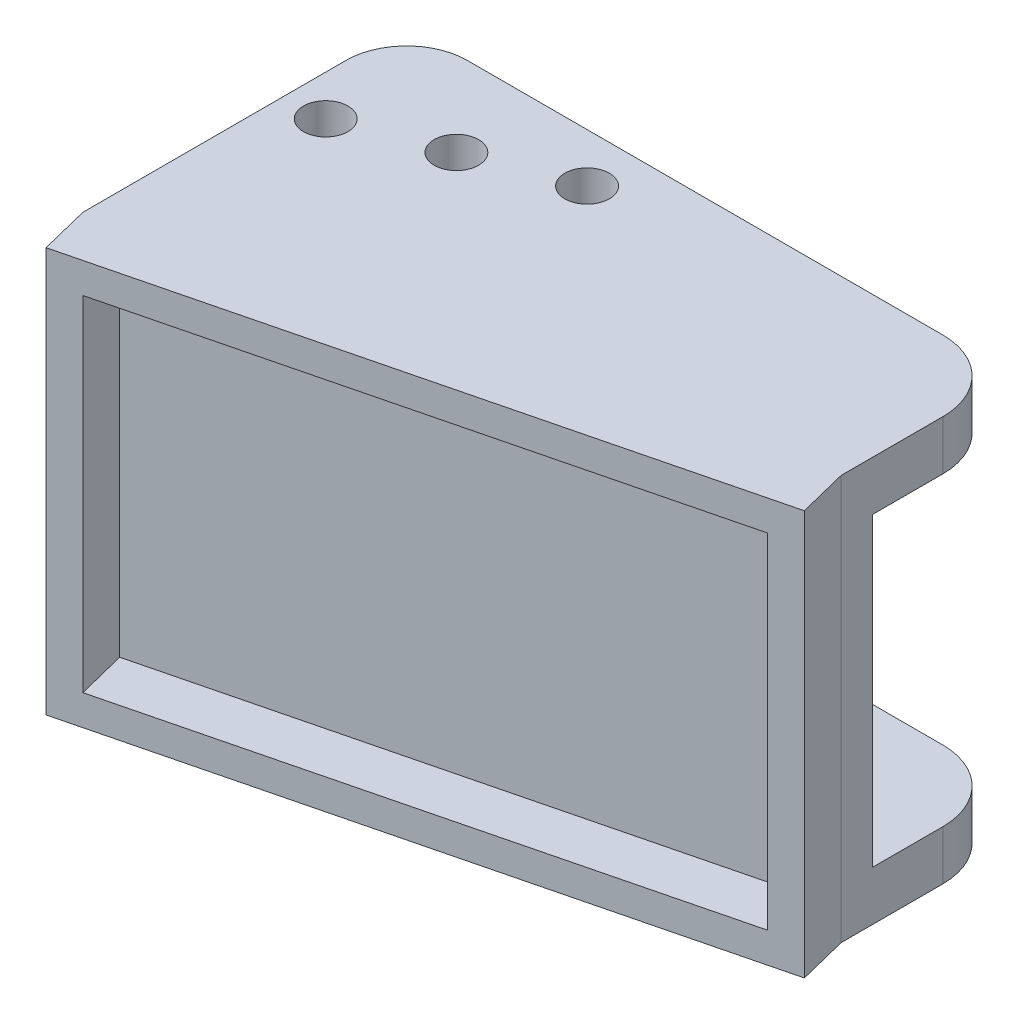
ISO-10303-21;
HEADER;
FILE_DESCRIPTION(('STEP AP214'),'2;1');
FILE_NAME('part.step','',(''),(''),'','','');
FILE_SCHEMA(('AUTOMOTIVE_DESIGN { 1 0 10303 214 1 1 1 1 }'));
ENDSEC;
DATA;
#1=APPLICATION_CONTEXT('core data for automotive mechanical design processes');
#2=APPLICATION_PROTOCOL_DEFINITION('international standard','automotive_design',2000,#1);
#3=PRODUCT_CONTEXT('',#1,'mechanical');
#4=PRODUCT('Part','Part','',(#3));
#5=PRODUCT_RELATED_PRODUCT_CATEGORY('part','',(#4));
#6=PRODUCT_DEFINITION_FORMATION('','',#4);
#7=PRODUCT_DEFINITION_CONTEXT('part definition',#1,'design');
#8=PRODUCT_DEFINITION('design','',#6,#7);
#9=PRODUCT_DEFINITION_SHAPE('','',#8);
#10=(LENGTH_UNIT() NAMED_UNIT(*) SI_UNIT(.MILLI.,.METRE.));
#11=(NAMED_UNIT(*) PLANE_ANGLE_UNIT() SI_UNIT($,.RADIAN.));
#12=(NAMED_UNIT(*) SI_UNIT($,.STERADIAN.) SOLID_ANGLE_UNIT());
#13=UNCERTAINTY_MEASURE_WITH_UNIT(LENGTH_MEASURE(1.E-05),#10,'distance_accuracy_value','');
#14=(GEOMETRIC_REPRESENTATION_CONTEXT(3) GLOBAL_UNCERTAINTY_ASSIGNED_CONTEXT((#13)) GLOBAL_UNIT_ASSIGNED_CONTEXT((#10,
#11,#12)) REPRESENTATION_CONTEXT('',''));
#15=CARTESIAN_POINT('',(0.,0.,0.));
#16=DIRECTION('',(0.,0.,1.));
#17=DIRECTION('',(1.,0.,0.));
#18=AXIS2_PLACEMENT_3D('',#15,#16,#17);
#19=CARTESIAN_POINT('',(-15.,20.,-8.));
#20=DIRECTION('',(0.,0.,1.));
#21=DIRECTION('',(1.,0.,0.));
#22=AXIS2_PLACEMENT_3D('',#19,#20,#21);
#23=PLANE('',#22);
#24=DIRECTION('',(-1.,0.,0.));
#25=VECTOR('',#24,1.);
#26=CARTESIAN_POINT('',(15.,2.45,-8.));
#27=LINE('',#26,#25);
#28=CARTESIAN_POINT('',(11.5,2.45,-8.));
#29=VERTEX_POINT('',#28);
#30=CARTESIAN_POINT('',(-12.,2.45,-8.));
#31=VERTEX_POINT('',#30);
#32=EDGE_CURVE('E228',#29,#31,#27,.T.);
#33=ORIENTED_EDGE('',*,*,#32,.F.);
#34=DIRECTION('',(0.,-1.,0.));
#35=VECTOR('',#34,1.);
#36=CARTESIAN_POINT('',(11.5,20.,-8.));
#37=LINE('',#36,#35);
#38=CARTESIAN_POINT('',(11.5,0.,-8.));
#39=VERTEX_POINT('',#38);
#40=EDGE_CURVE('E333',#29,#39,#37,.T.);
#41=ORIENTED_EDGE('',*,*,#40,.T.);
#42=DIRECTION('',(-1.,0.,0.));
#43=VECTOR('',#42,1.);
#44=CARTESIAN_POINT('',(-15.,0.,-8.));
#45=LINE('',#44,#43);
#46=CARTESIAN_POINT('',(-12.,0.,-8.));
#47=VERTEX_POINT('',#46);
#48=EDGE_CURVE('E293',#39,#47,#45,.T.);
#49=ORIENTED_EDGE('',*,*,#48,.T.);
#50=DIRECTION('',(0.,-1.,0.));
#51=VECTOR('',#50,1.);
#52=CARTESIAN_POINT('',(-12.,20.,-8.));
#53=LINE('',#52,#51);
#54=EDGE_CURVE('E321',#47,#31,#53,.F.);
#55=ORIENTED_EDGE('',*,*,#54,.T.);
#56=EDGE_LOOP('',(#33,#41,#49,#55));
#57=FACE_BOUND('',#56,.T.);
#58=ADVANCED_FACE('F41',(#57),#23,.F.);
#59=CARTESIAN_POINT('',(-3.66419573502799,0.,-5.58367949545302));
#60=DIRECTION('',(0.,1.,0.));
#61=DIRECTION('',(0.,0.,1.));
#62=AXIS2_PLACEMENT_3D('',#59,#60,#61);
#63=CYLINDRICAL_SURFACE('',#62,1.1);
#64=CARTESIAN_POINT('',(-3.66419573502799,2.45,-5.58367949545302));
#65=DIRECTION('',(0.,-1.,0.));
#66=DIRECTION('',(0.,0.,-1.));
#67=AXIS2_PLACEMENT_3D('',#64,#65,#66);
#68=CIRCLE('',#67,1.1);
#69=CARTESIAN_POINT('',(-3.66419573502799,2.45,-6.68367949545302));
#70=VERTEX_POINT('',#69);
#71=EDGE_CURVE('E268',#70,#70,#68,.F.);
#72=ORIENTED_EDGE('',*,*,#71,.T.);
#73=EDGE_LOOP('',(#72));
#74=FACE_BOUND('',#73,.T.);
#75=CARTESIAN_POINT('',(-3.66419573502799,0.,-5.58367949545302));
#76=DIRECTION('',(0.,1.,0.));
#77=DIRECTION('',(0.,0.,1.));
#78=AXIS2_PLACEMENT_3D('',#75,#76,#77);
#79=CIRCLE('',#78,1.1);
#80=CARTESIAN_POINT('',(-3.66419573502799,0.,-4.48367949545302));
#81=VERTEX_POINT('',#80);
#82=EDGE_CURVE('E271',#81,#81,#79,.T.);
#83=ORIENTED_EDGE('',*,*,#82,.F.);
#84=EDGE_LOOP('',(#83));
#85=FACE_BOUND('',#84,.T.);
#86=ADVANCED_FACE('F402',(#74,#85),#63,.F.);
#87=CARTESIAN_POINT('',(-8.33209786751399,0.,-3.79183974772651));
#88=DIRECTION('',(0.,1.,0.));
#89=DIRECTION('',(0.,0.,1.));
#90=AXIS2_PLACEMENT_3D('',#87,#88,#89);
#91=CYLINDRICAL_SURFACE('',#90,1.1);
#92=CARTESIAN_POINT('',(-8.33209786751399,2.45,-3.79183974772651));
#93=DIRECTION('',(0.,-1.,0.));
#94=DIRECTION('',(0.,0.,-1.));
#95=AXIS2_PLACEMENT_3D('',#92,#93,#94);
#96=CIRCLE('',#95,1.1);
#97=CARTESIAN_POINT('',(-8.33209786751399,2.45,-4.89183974772651));
#98=VERTEX_POINT('',#97);
#99=EDGE_CURVE('E265',#98,#98,#96,.F.);
#100=ORIENTED_EDGE('',*,*,#99,.T.);
#101=EDGE_LOOP('',(#100));
#102=FACE_BOUND('',#101,.T.);
#103=CARTESIAN_POINT('',(-8.33209786751399,0.,-3.79183974772651));
#104=DIRECTION('',(0.,1.,0.));
#105=DIRECTION('',(0.,0.,1.));
#106=AXIS2_PLACEMENT_3D('',#103,#104,#105);
#107=CIRCLE('',#106,1.1);
#108=CARTESIAN_POINT('',(-8.33209786751399,0.,-2.69183974772651));
#109=VERTEX_POINT('',#108);
#110=EDGE_CURVE('E282',#109,#109,#107,.T.);
#111=ORIENTED_EDGE('',*,*,#110,.F.);
#112=EDGE_LOOP('',(#111));
#113=FACE_BOUND('',#112,.T.);
#114=ADVANCED_FACE('F409',(#102,#113),#91,.F.);
#115=CARTESIAN_POINT('',(-13.,0.,-2.));
#116=DIRECTION('',(0.,1.,0.));
#117=DIRECTION('',(0.,0.,1.));
#118=AXIS2_PLACEMENT_3D('',#115,#116,#117);
#119=CYLINDRICAL_SURFACE('',#118,1.1);
#120=CARTESIAN_POINT('',(-13.,2.45,-2.));
#121=DIRECTION('',(0.,-1.,0.));
#122=DIRECTION('',(0.,0.,-1.));
#123=AXIS2_PLACEMENT_3D('',#120,#121,#122);
#124=CIRCLE('',#123,1.1);
#125=CARTESIAN_POINT('',(-13.,2.45,-3.1));
#126=VERTEX_POINT('',#125);
#127=EDGE_CURVE('E264',#126,#126,#124,.F.);
#128=ORIENTED_EDGE('',*,*,#127,.T.);
#129=EDGE_LOOP('',(#128));
#130=FACE_BOUND('',#129,.T.);
#131=CARTESIAN_POINT('',(-13.,0.,-2.));
#132=DIRECTION('',(0.,1.,0.));
#133=DIRECTION('',(0.,0.,1.));
#134=AXIS2_PLACEMENT_3D('',#131,#132,#133);
#135=CIRCLE('',#134,1.1);
#136=CARTESIAN_POINT('',(-13.,0.,-0.9));
#137=VERTEX_POINT('',#136);
#138=EDGE_CURVE('E272',#137,#137,#135,.T.);
#139=ORIENTED_EDGE('',*,*,#138,.F.);
#140=EDGE_LOOP('',(#139));
#141=FACE_BOUND('',#140,.T.);
#142=ADVANCED_FACE('F424',(#130,#141),#119,.F.);
#143=CARTESIAN_POINT('',(-15.,20.,-8.));
#144=DIRECTION('',(1.,0.,0.));
#145=DIRECTION('',(0.,0.,-1.));
#146=AXIS2_PLACEMENT_3D('',#143,#144,#145);
#147=PLANE('',#146);
#148=DIRECTION('',(0.,0.,-1.));
#149=VECTOR('',#148,1.);
#150=CARTESIAN_POINT('',(-15.,2.45,36.8141121698799));
#151=LINE('',#150,#149);
#152=CARTESIAN_POINT('',(-15.,2.45,6.45407955597516));
#153=VERTEX_POINT('',#152);
#154=CARTESIAN_POINT('',(-15.,2.45,-5.));
#155=VERTEX_POINT('',#154);
#156=EDGE_CURVE('E236',#153,#155,#151,.T.);
#157=ORIENTED_EDGE('',*,*,#156,.T.);
#158=DIRECTION('',(0.,-1.,0.));
#159=VECTOR('',#158,1.);
#160=CARTESIAN_POINT('',(-15.,20.,-5.));
#161=LINE('',#160,#159);
#162=CARTESIAN_POINT('',(-15.,0.,-5.));
#163=VERTEX_POINT('',#162);
#164=EDGE_CURVE('E315',#155,#163,#161,.T.);
#165=ORIENTED_EDGE('',*,*,#164,.T.);
#166=DIRECTION('',(0.,0.,1.));
#167=VECTOR('',#166,1.);
#168=CARTESIAN_POINT('',(-15.,0.,-8.));
#169=LINE('',#168,#167);
#170=CARTESIAN_POINT('',(-15.,0.,8.));
#171=VERTEX_POINT('',#170);
#172=EDGE_CURVE('E275',#163,#171,#169,.T.);
#173=ORIENTED_EDGE('',*,*,#172,.T.);
#174=DIRECTION('',(0.,-1.,0.));
#175=VECTOR('',#174,1.);
#176=CARTESIAN_POINT('',(-15.,20.,8.));
#177=LINE('',#176,#175);
#178=CARTESIAN_POINT('',(-15.,20.,8.));
#179=VERTEX_POINT('',#178);
#180=EDGE_CURVE('E305',#179,#171,#177,.T.);
#181=ORIENTED_EDGE('',*,*,#180,.F.);
#182=DIRECTION('',(0.,0.,1.));
#183=VECTOR('',#182,1.);
#184=CARTESIAN_POINT('',(-15.,20.,-8.));
#185=LINE('',#184,#183);
#186=CARTESIAN_POINT('',(-15.,20.,-5.));
#187=VERTEX_POINT('',#186);
#188=EDGE_CURVE('E290',#187,#179,#185,.T.);
#189=ORIENTED_EDGE('',*,*,#188,.F.);
#190=DIRECTION('',(0.,-1.,0.));
#191=VECTOR('',#190,1.);
#192=CARTESIAN_POINT('',(-15.,20.,-5.));
#193=LINE('',#192,#191);
#194=CARTESIAN_POINT('',(-15.,17.55,-5.));
#195=VERTEX_POINT('',#194);
#196=EDGE_CURVE('E308',#187,#195,#193,.T.);
#197=ORIENTED_EDGE('',*,*,#196,.T.);
#198=DIRECTION('',(0.,0.,-1.));
#199=VECTOR('',#198,1.);
#200=CARTESIAN_POINT('',(-15.,17.55,36.8141121698799));
#201=LINE('',#200,#199);
#202=CARTESIAN_POINT('',(-15.,17.55,6.45407955597516));
#203=VERTEX_POINT('',#202);
#204=EDGE_CURVE('E245',#203,#195,#201,.T.);
#205=ORIENTED_EDGE('',*,*,#204,.F.);
#206=DIRECTION('',(0.,1.,0.));
#207=VECTOR('',#206,1.);
#208=CARTESIAN_POINT('',(-15.,17.55,6.45407955597516));
#209=LINE('',#208,#207);
#210=EDGE_CURVE('E246',#153,#203,#209,.T.);
#211=ORIENTED_EDGE('',*,*,#210,.F.);
#212=EDGE_LOOP('',(#157,#165,#173,#181,#189,#197,#205,#211));
#213=FACE_BOUND('',#212,.T.);
#214=ADVANCED_FACE('F364',(#213),#147,.F.);
#215=CARTESIAN_POINT('',(15.,20.,-8.));
#216=DIRECTION('',(-1.,0.,0.));
#217=DIRECTION('',(0.,0.,1.));
#218=AXIS2_PLACEMENT_3D('',#215,#216,#217);
#219=PLANE('',#218);
#220=DIRECTION('',(0.,0.,-1.));
#221=VECTOR('',#220,1.);
#222=CARTESIAN_POINT('',(15.,0.,-8.));
#223=LINE('',#222,#221);
#224=CARTESIAN_POINT('',(15.,0.,0.520159914704548));
#225=VERTEX_POINT('',#224);
#226=CARTESIAN_POINT('',(15.,0.,-4.5));
#227=VERTEX_POINT('',#226);
#228=EDGE_CURVE('E299',#225,#227,#223,.T.);
#229=ORIENTED_EDGE('',*,*,#228,.T.);
#230=DIRECTION('',(0.,-1.,0.));
#231=VECTOR('',#230,1.);
#232=CARTESIAN_POINT('',(15.,20.,-4.5));
#233=LINE('',#232,#231);
#234=CARTESIAN_POINT('',(15.,2.45,-4.5));
#235=VERTEX_POINT('',#234);
#236=EDGE_CURVE('E340',#227,#235,#233,.F.);
#237=ORIENTED_EDGE('',*,*,#236,.T.);
#238=DIRECTION('',(0.,0.,-1.));
#239=VECTOR('',#238,1.);
#240=CARTESIAN_POINT('',(15.,2.45,36.8141121698799));
#241=LINE('',#240,#239);
#242=CARTESIAN_POINT('',(15.,2.45,-1.0257605293203));
#243=VERTEX_POINT('',#242);
#244=EDGE_CURVE('E240',#243,#235,#241,.T.);
#245=ORIENTED_EDGE('',*,*,#244,.F.);
#246=DIRECTION('',(0.,-1.,0.));
#247=VECTOR('',#246,1.);
#248=CARTESIAN_POINT('',(15.,17.55,-1.0257605293203));
#249=LINE('',#248,#247);
#250=CARTESIAN_POINT('',(15.,17.55,-1.0257605293203));
#251=VERTEX_POINT('',#250);
#252=EDGE_CURVE('E237',#251,#243,#249,.T.);
#253=ORIENTED_EDGE('',*,*,#252,.F.);
#254=DIRECTION('',(0.,0.,-1.));
#255=VECTOR('',#254,1.);
#256=CARTESIAN_POINT('',(15.,17.55,36.8141121698799));
#257=LINE('',#256,#255);
#258=CARTESIAN_POINT('',(15.,17.55,-4.5));
#259=VERTEX_POINT('',#258);
#260=EDGE_CURVE('E241',#251,#259,#257,.T.);
#261=ORIENTED_EDGE('',*,*,#260,.T.);
#262=DIRECTION('',(0.,-1.,0.));
#263=VECTOR('',#262,1.);
#264=CARTESIAN_POINT('',(15.,20.,-4.5));
#265=LINE('',#264,#263);
#266=CARTESIAN_POINT('',(15.,20.,-4.5));
#267=VERTEX_POINT('',#266);
#268=EDGE_CURVE('E338',#259,#267,#265,.F.);
#269=ORIENTED_EDGE('',*,*,#268,.T.);
#270=DIRECTION('',(0.,0.,-1.));
#271=VECTOR('',#270,1.);
#272=CARTESIAN_POINT('',(15.,20.,-8.));
#273=LINE('',#272,#271);
#274=CARTESIAN_POINT('',(15.,20.,0.520159914704548));
#275=VERTEX_POINT('',#274);
#276=EDGE_CURVE('E292',#275,#267,#273,.T.);
#277=ORIENTED_EDGE('',*,*,#276,.F.);
#278=DIRECTION('',(0.,-1.,0.));
#279=VECTOR('',#278,1.);
#280=CARTESIAN_POINT('',(15.,20.,0.520159914704548));
#281=LINE('',#280,#279);
#282=EDGE_CURVE('E297',#275,#225,#281,.T.);
#283=ORIENTED_EDGE('',*,*,#282,.T.);
#284=EDGE_LOOP('',(#229,#237,#245,#253,#261,#269,#277,#283));
#285=FACE_BOUND('',#284,.T.);
#286=ADVANCED_FACE('F351',(#285),#219,.F.);
#287=DIRECTION('',(-1.,0.,0.));
#288=VECTOR('',#287,1.);
#289=CARTESIAN_POINT('',(-15.,20.,-8.));
#290=LINE('',#289,#288);
#291=CARTESIAN_POINT('',(11.5,20.,-8.));
#292=VERTEX_POINT('',#291);
#293=CARTESIAN_POINT('',(-12.,20.,-8.));
#294=VERTEX_POINT('',#293);
#295=EDGE_CURVE('E295',#292,#294,#290,.T.);
#296=ORIENTED_EDGE('',*,*,#295,.F.);
#297=DIRECTION('',(0.,-1.,0.));
#298=VECTOR('',#297,1.);
#299=CARTESIAN_POINT('',(11.5,20.,-8.));
#300=LINE('',#299,#298);
#301=CARTESIAN_POINT('',(11.5,17.55,-8.));
#302=VERTEX_POINT('',#301);
#303=EDGE_CURVE('E344',#292,#302,#300,.T.);
#304=ORIENTED_EDGE('',*,*,#303,.T.);
#305=DIRECTION('',(1.,0.,0.));
#306=VECTOR('',#305,1.);
#307=CARTESIAN_POINT('',(15.,17.55,-8.));
#308=LINE('',#307,#306);
#309=CARTESIAN_POINT('',(-12.,17.55,-8.));
#310=VERTEX_POINT('',#309);
#311=EDGE_CURVE('E229',#310,#302,#308,.T.);
#312=ORIENTED_EDGE('',*,*,#311,.F.);
#313=DIRECTION('',(0.,-1.,0.));
#314=VECTOR('',#313,1.);
#315=CARTESIAN_POINT('',(-12.,20.,-8.));
#316=LINE('',#315,#314);
#317=EDGE_CURVE('E328',#310,#294,#316,.F.);
#318=ORIENTED_EDGE('',*,*,#317,.T.);
#319=EDGE_LOOP('',(#296,#304,#312,#318));
#320=FACE_BOUND('',#319,.T.);
#321=ADVANCED_FACE('F354',(#320),#23,.F.);
#322=CARTESIAN_POINT('',(0.,20.,0.));
#323=DIRECTION('',(0.,1.,0.));
#324=DIRECTION('',(0.,0.,1.));
#325=AXIS2_PLACEMENT_3D('',#322,#323,#324);
#326=PLANE('',#325);
#327=CARTESIAN_POINT('',(-13.,20.,-2.));
#328=DIRECTION('',(0.,1.,0.));
#329=DIRECTION('',(0.,0.,1.));
#330=AXIS2_PLACEMENT_3D('',#327,#328,#329);
#331=CIRCLE('',#330,1.1);
#332=CARTESIAN_POINT('',(-13.,20.,-0.9));
#333=VERTEX_POINT('',#332);
#334=EDGE_CURVE('E276',#333,#333,#331,.T.);
#335=ORIENTED_EDGE('',*,*,#334,.F.);
#336=EDGE_LOOP('',(#335));
#337=FACE_BOUND('',#336,.T.);
#338=CARTESIAN_POINT('',(-8.33209786751399,20.,-3.79183974772651));
#339=DIRECTION('',(0.,1.,0.));
#340=DIRECTION('',(0.,0.,1.));
#341=AXIS2_PLACEMENT_3D('',#338,#339,#340);
#342=CIRCLE('',#341,1.1);
#343=CARTESIAN_POINT('',(-8.33209786751399,20.,-2.69183974772651));
#344=VERTEX_POINT('',#343);
#345=EDGE_CURVE('E279',#344,#344,#342,.T.);
#346=ORIENTED_EDGE('',*,*,#345,.F.);
#347=EDGE_LOOP('',(#346));
#348=FACE_BOUND('',#347,.T.);
#349=CARTESIAN_POINT('',(-3.66419573502799,20.,-5.58367949545302));
#350=DIRECTION('',(0.,1.,0.));
#351=DIRECTION('',(0.,0.,1.));
#352=AXIS2_PLACEMENT_3D('',#349,#350,#351);
#353=CIRCLE('',#352,1.1);
#354=CARTESIAN_POINT('',(-3.66419573502799,20.,-4.48367949545302));
#355=VERTEX_POINT('',#354);
#356=EDGE_CURVE('E285',#355,#355,#353,.T.);
#357=ORIENTED_EDGE('',*,*,#356,.F.);
#358=EDGE_LOOP('',(#357));
#359=FACE_BOUND('',#358,.T.);
#360=ORIENTED_EDGE('',*,*,#276,.T.);
#361=CARTESIAN_POINT('',(11.5,20.,-4.5));
#362=DIRECTION('',(0.,1.,0.));
#363=DIRECTION('',(0.,0.,1.));
#364=AXIS2_PLACEMENT_3D('',#361,#362,#363);
#365=CIRCLE('',#364,3.5);
#366=EDGE_CURVE('E11',#267,#292,#365,.T.);
#367=ORIENTED_EDGE('',*,*,#366,.T.);
#368=ORIENTED_EDGE('',*,*,#295,.T.);
#369=CARTESIAN_POINT('',(-12.,20.,-5.));
#370=DIRECTION('',(0.,1.,0.));
#371=DIRECTION('',(0.,0.,1.));
#372=AXIS2_PLACEMENT_3D('',#369,#370,#371);
#373=CIRCLE('',#372,3.);
#374=EDGE_CURVE('E331',#294,#187,#373,.T.);
#375=ORIENTED_EDGE('',*,*,#374,.T.);
#376=ORIENTED_EDGE('',*,*,#188,.T.);
#377=DIRECTION('',(-0.241921895599669,0.,-0.970295726275996));
#378=VECTOR('',#377,1.);
#379=CARTESIAN_POINT('',(-14.3951952610008,20.,10.42573931569));
#380=LINE('',#379,#378);
#381=CARTESIAN_POINT('',(-14.3951952610008,20.,10.42573931569));
#382=VERTEX_POINT('',#381);
#383=EDGE_CURVE('E216',#382,#179,#380,.T.);
#384=ORIENTED_EDGE('',*,*,#383,.F.);
#385=DIRECTION('',(-0.970295726275996,0.,0.241921895599669));
#386=VECTOR('',#385,1.);
#387=CARTESIAN_POINT('',(-14.3951952610008,20.,10.42573931569));
#388=LINE('',#387,#386);
#389=CARTESIAN_POINT('',(15.6048047389992,20.,2.94589923039454));
#390=VERTEX_POINT('',#389);
#391=EDGE_CURVE('E214',#390,#382,#388,.T.);
#392=ORIENTED_EDGE('',*,*,#391,.F.);
#393=DIRECTION('',(-0.241921895599669,0.,-0.970295726275996));
#394=VECTOR('',#393,1.);
#395=CARTESIAN_POINT('',(15.6048047389992,20.,2.94589923039454));
#396=LINE('',#395,#394);
#397=EDGE_CURVE('E219',#390,#275,#396,.T.);
#398=ORIENTED_EDGE('',*,*,#397,.T.);
#399=EDGE_LOOP('',(#360,#367,#368,#375,#376,#384,#392,#398));
#400=FACE_BOUND('',#399,.T.);
#401=ADVANCED_FACE('F357',(#337,#348,#359,#400),#326,.T.);
#402=CARTESIAN_POINT('',(0.,0.,0.));
#403=DIRECTION('',(0.,1.,0.));
#404=DIRECTION('',(0.,0.,1.));
#405=AXIS2_PLACEMENT_3D('',#402,#403,#404);
#406=PLANE('',#405);
#407=ORIENTED_EDGE('',*,*,#138,.T.);
#408=EDGE_LOOP('',(#407));
#409=FACE_BOUND('',#408,.T.);
#410=ORIENTED_EDGE('',*,*,#110,.T.);
#411=EDGE_LOOP('',(#410));
#412=FACE_BOUND('',#411,.T.);
#413=ORIENTED_EDGE('',*,*,#82,.T.);
#414=EDGE_LOOP('',(#413));
#415=FACE_BOUND('',#414,.T.);
#416=ORIENTED_EDGE('',*,*,#48,.F.);
#417=CARTESIAN_POINT('',(11.5,0.,-4.5));
#418=DIRECTION('',(0.,1.,0.));
#419=DIRECTION('',(0.,0.,1.));
#420=AXIS2_PLACEMENT_3D('',#417,#418,#419);
#421=CIRCLE('',#420,3.5);
#422=EDGE_CURVE('E336',#39,#227,#421,.F.);
#423=ORIENTED_EDGE('',*,*,#422,.T.);
#424=ORIENTED_EDGE('',*,*,#228,.F.);
#425=DIRECTION('',(-0.241921895599669,0.,-0.970295726275996));
#426=VECTOR('',#425,1.);
#427=CARTESIAN_POINT('',(15.6048047389992,0.,2.94589923039454));
#428=LINE('',#427,#426);
#429=CARTESIAN_POINT('',(15.6048047389992,0.,2.94589923039454));
#430=VERTEX_POINT('',#429);
#431=EDGE_CURVE('E222',#430,#225,#428,.T.);
#432=ORIENTED_EDGE('',*,*,#431,.F.);
#433=DIRECTION('',(0.970295726275996,0.,-0.241921895599669));
#434=VECTOR('',#433,1.);
#435=CARTESIAN_POINT('',(-14.3951952610008,0.,10.42573931569));
#436=LINE('',#435,#434);
#437=CARTESIAN_POINT('',(-14.3951952610008,0.,10.42573931569));
#438=VERTEX_POINT('',#437);
#439=EDGE_CURVE('E210',#438,#430,#436,.T.);
#440=ORIENTED_EDGE('',*,*,#439,.F.);
#441=DIRECTION('',(-0.241921895599669,0.,-0.970295726275996));
#442=VECTOR('',#441,1.);
#443=CARTESIAN_POINT('',(-14.3951952610008,0.,10.42573931569));
#444=LINE('',#443,#442);
#445=EDGE_CURVE('E225',#438,#171,#444,.T.);
#446=ORIENTED_EDGE('',*,*,#445,.T.);
#447=ORIENTED_EDGE('',*,*,#172,.F.);
#448=CARTESIAN_POINT('',(-12.,0.,-5.));
#449=DIRECTION('',(0.,1.,0.));
#450=DIRECTION('',(0.,0.,1.));
#451=AXIS2_PLACEMENT_3D('',#448,#449,#450);
#452=CIRCLE('',#451,3.);
#453=EDGE_CURVE('E318',#163,#47,#452,.F.);
#454=ORIENTED_EDGE('',*,*,#453,.T.);
#455=EDGE_LOOP('',(#416,#423,#424,#432,#440,#446,#447,#454));
#456=FACE_BOUND('',#455,.T.);
#457=ADVANCED_FACE('F383',(#409,#412,#415,#456),#406,.F.);
#458=CARTESIAN_POINT('',(-3.66419573502799,17.55,-5.58367949545302));
#459=DIRECTION('',(0.,1.,0.));
#460=DIRECTION('',(0.,0.,1.));
#461=AXIS2_PLACEMENT_3D('',#458,#459,#460);
#462=CIRCLE('',#461,1.1);
#463=CARTESIAN_POINT('',(-3.66419573502799,17.55,-4.48367949545302));
#464=VERTEX_POINT('',#463);
#465=EDGE_CURVE('E261',#464,#464,#462,.F.);
#466=ORIENTED_EDGE('',*,*,#465,.T.);
#467=EDGE_LOOP('',(#466));
#468=FACE_BOUND('',#467,.T.);
#469=ORIENTED_EDGE('',*,*,#356,.T.);
#470=EDGE_LOOP('',(#469));
#471=FACE_BOUND('',#470,.T.);
#472=ADVANCED_FACE('F412',(#468,#471),#63,.F.);
#473=CARTESIAN_POINT('',(-8.33209786751399,17.55,-3.79183974772651));
#474=DIRECTION('',(0.,1.,0.));
#475=DIRECTION('',(0.,0.,1.));
#476=AXIS2_PLACEMENT_3D('',#473,#474,#475);
#477=CIRCLE('',#476,1.1);
#478=CARTESIAN_POINT('',(-8.33209786751399,17.55,-2.69183974772651));
#479=VERTEX_POINT('',#478);
#480=EDGE_CURVE('E258',#479,#479,#477,.F.);
#481=ORIENTED_EDGE('',*,*,#480,.T.);
#482=EDGE_LOOP('',(#481));
#483=FACE_BOUND('',#482,.T.);
#484=ORIENTED_EDGE('',*,*,#345,.T.);
#485=EDGE_LOOP('',(#484));
#486=FACE_BOUND('',#485,.T.);
#487=ADVANCED_FACE('F583',(#483,#486),#91,.F.);
#488=CARTESIAN_POINT('',(-13.,17.55,-2.));
#489=DIRECTION('',(0.,1.,0.));
#490=DIRECTION('',(0.,0.,1.));
#491=AXIS2_PLACEMENT_3D('',#488,#489,#490);
#492=CIRCLE('',#491,1.1);
#493=CARTESIAN_POINT('',(-13.,17.55,-0.9));
#494=VERTEX_POINT('',#493);
#495=EDGE_CURVE('E257',#494,#494,#492,.F.);
#496=ORIENTED_EDGE('',*,*,#495,.T.);
#497=EDGE_LOOP('',(#496));
#498=FACE_BOUND('',#497,.T.);
#499=ORIENTED_EDGE('',*,*,#334,.T.);
#500=EDGE_LOOP('',(#499));
#501=FACE_BOUND('',#500,.T.);
#502=ADVANCED_FACE('F562',(#498,#501),#119,.F.);
#503=CARTESIAN_POINT('',(15.,2.45,36.8141121698799));
#504=DIRECTION('',(0.,-1.,0.));
#505=DIRECTION('',(0.,0.,-1.));
#506=AXIS2_PLACEMENT_3D('',#503,#504,#505);
#507=PLANE('',#506);
#508=ORIENTED_EDGE('',*,*,#99,.F.);
#509=EDGE_LOOP('',(#508));
#510=FACE_BOUND('',#509,.T.);
#511=ORIENTED_EDGE('',*,*,#244,.T.);
#512=CARTESIAN_POINT('',(11.5,2.45,-4.5));
#513=DIRECTION('',(0.,-1.,0.));
#514=DIRECTION('',(0.,0.,-1.));
#515=AXIS2_PLACEMENT_3D('',#512,#513,#514);
#516=CIRCLE('',#515,3.5);
#517=EDGE_CURVE('E342',#235,#29,#516,.F.);
#518=ORIENTED_EDGE('',*,*,#517,.T.);
#519=ORIENTED_EDGE('',*,*,#32,.T.);
#520=CARTESIAN_POINT('',(-12.,2.45,-5.));
#521=DIRECTION('',(0.,-1.,0.));
#522=DIRECTION('',(0.,0.,-1.));
#523=AXIS2_PLACEMENT_3D('',#520,#521,#522);
#524=CIRCLE('',#523,3.);
#525=EDGE_CURVE('E324',#31,#155,#524,.F.);
#526=ORIENTED_EDGE('',*,*,#525,.T.);
#527=ORIENTED_EDGE('',*,*,#156,.F.);
#528=DIRECTION('',(-0.970295726275996,0.,0.241921895599669));
#529=VECTOR('',#528,1.);
#530=CARTESIAN_POINT('',(6.11762791414362,2.45,1.1888635633563));
#531=LINE('',#530,#529);
#532=EDGE_CURVE('E232',#243,#153,#531,.T.);
#533=ORIENTED_EDGE('',*,*,#532,.F.);
#534=EDGE_LOOP('',(#511,#518,#519,#526,#527,#533));
#535=FACE_BOUND('',#534,.T.);
#536=ORIENTED_EDGE('',*,*,#127,.F.);
#537=EDGE_LOOP('',(#536));
#538=FACE_BOUND('',#537,.T.);
#539=ORIENTED_EDGE('',*,*,#71,.F.);
#540=EDGE_LOOP('',(#539));
#541=FACE_BOUND('',#540,.T.);
#542=ADVANCED_FACE('F372',(#510,#535,#538,#541),#507,.F.);
#543=CARTESIAN_POINT('',(15.,17.55,36.8141121698799));
#544=DIRECTION('',(0.,1.,0.));
#545=DIRECTION('',(0.,0.,1.));
#546=AXIS2_PLACEMENT_3D('',#543,#544,#545);
#547=PLANE('',#546);
#548=ORIENTED_EDGE('',*,*,#480,.F.);
#549=EDGE_LOOP('',(#548));
#550=FACE_BOUND('',#549,.T.);
#551=ORIENTED_EDGE('',*,*,#311,.T.);
#552=CARTESIAN_POINT('',(11.5,17.55,-4.5));
#553=DIRECTION('',(0.,1.,0.));
#554=DIRECTION('',(0.,0.,1.));
#555=AXIS2_PLACEMENT_3D('',#552,#553,#554);
#556=CIRCLE('',#555,3.5);
#557=EDGE_CURVE('E49',#302,#259,#556,.F.);
#558=ORIENTED_EDGE('',*,*,#557,.T.);
#559=ORIENTED_EDGE('',*,*,#260,.F.);
#560=DIRECTION('',(0.970295726275996,0.,-0.241921895599669));
#561=VECTOR('',#560,1.);
#562=CARTESIAN_POINT('',(6.11762791414362,17.55,1.1888635633563));
#563=LINE('',#562,#561);
#564=EDGE_CURVE('E242',#203,#251,#563,.T.);
#565=ORIENTED_EDGE('',*,*,#564,.F.);
#566=ORIENTED_EDGE('',*,*,#204,.T.);
#567=CARTESIAN_POINT('',(-12.,17.55,-5.));
#568=DIRECTION('',(0.,1.,0.));
#569=DIRECTION('',(0.,0.,1.));
#570=AXIS2_PLACEMENT_3D('',#567,#568,#569);
#571=CIRCLE('',#570,3.);
#572=EDGE_CURVE('E326',#195,#310,#571,.F.);
#573=ORIENTED_EDGE('',*,*,#572,.T.);
#574=EDGE_LOOP('',(#551,#558,#559,#565,#566,#573));
#575=FACE_BOUND('',#574,.T.);
#576=ORIENTED_EDGE('',*,*,#495,.F.);
#577=EDGE_LOOP('',(#576));
#578=FACE_BOUND('',#577,.T.);
#579=ORIENTED_EDGE('',*,*,#465,.F.);
#580=EDGE_LOOP('',(#579));
#581=FACE_BOUND('',#580,.T.);
#582=ADVANCED_FACE('F346',(#550,#575,#578,#581),#547,.F.);
#583=CARTESIAN_POINT('',(0.637110354186013,0.,2.55531006112752));
#584=DIRECTION('',(0.241921895599669,0.,0.970295726275996));
#585=DIRECTION('',(0.970295726275996,0.,-0.241921895599669));
#586=AXIS2_PLACEMENT_3D('',#583,#584,#585);
#587=PLANE('',#586);
#588=ORIENTED_EDGE('',*,*,#252,.T.);
#589=ORIENTED_EDGE('',*,*,#532,.T.);
#590=ORIENTED_EDGE('',*,*,#210,.T.);
#591=ORIENTED_EDGE('',*,*,#564,.T.);
#592=EDGE_LOOP('',(#588,#589,#590,#591));
#593=FACE_BOUND('',#592,.T.);
#594=ADVANCED_FACE('F370',(#593),#587,.F.);
#595=CARTESIAN_POINT('',(-12.,20.,-5.));
#596=DIRECTION('',(0.,-1.,0.));
#597=DIRECTION('',(0.,0.,-1.));
#598=AXIS2_PLACEMENT_3D('',#595,#596,#597);
#599=CYLINDRICAL_SURFACE('',#598,3.);
#600=ORIENTED_EDGE('',*,*,#525,.F.);
#601=ORIENTED_EDGE('',*,*,#54,.F.);
#602=ORIENTED_EDGE('',*,*,#453,.F.);
#603=ORIENTED_EDGE('',*,*,#164,.F.);
#604=EDGE_LOOP('',(#600,#601,#602,#603));
#605=FACE_BOUND('',#604,.T.);
#606=ADVANCED_FACE('F379',(#605),#599,.T.);
#607=CARTESIAN_POINT('',(-12.,20.,-5.));
#608=DIRECTION('',(0.,-1.,0.));
#609=DIRECTION('',(0.,0.,-1.));
#610=AXIS2_PLACEMENT_3D('',#607,#608,#609);
#611=CYLINDRICAL_SURFACE('',#610,3.);
#612=ORIENTED_EDGE('',*,*,#374,.F.);
#613=ORIENTED_EDGE('',*,*,#317,.F.);
#614=ORIENTED_EDGE('',*,*,#572,.F.);
#615=ORIENTED_EDGE('',*,*,#196,.F.);
#616=EDGE_LOOP('',(#612,#613,#614,#615));
#617=FACE_BOUND('',#616,.T.);
#618=ADVANCED_FACE('F366',(#617),#611,.T.);
#619=CARTESIAN_POINT('',(1.60479793658469,0.,6.4364929662315));
#620=DIRECTION('',(0.241921895599669,0.,0.970295726275996));
#621=DIRECTION('',(0.970295726275996,0.,-0.241921895599669));
#622=AXIS2_PLACEMENT_3D('',#619,#620,#621);
#623=PLANE('',#622);
#624=DIRECTION('',(0.,-1.,0.));
#625=VECTOR('',#624,1.);
#626=CARTESIAN_POINT('',(-14.3951952610008,20.,10.42573931569));
#627=LINE('',#626,#625);
#628=EDGE_CURVE('E184',#382,#438,#627,.T.);
#629=ORIENTED_EDGE('',*,*,#628,.T.);
#630=ORIENTED_EDGE('',*,*,#439,.T.);
#631=DIRECTION('',(0.,1.,0.));
#632=VECTOR('',#631,1.);
#633=CARTESIAN_POINT('',(15.6048047389992,20.,2.94589923039454));
#634=LINE('',#633,#632);
#635=EDGE_CURVE('E212',#430,#390,#634,.T.);
#636=ORIENTED_EDGE('',*,*,#635,.T.);
#637=ORIENTED_EDGE('',*,*,#391,.T.);
#638=EDGE_LOOP('',(#629,#630,#636,#637));
#639=FACE_BOUND('',#638,.T.);
#640=DIRECTION('',(0.,-1.,0.));
#641=VECTOR('',#640,1.);
#642=CARTESIAN_POINT('',(-12.9397516715868,18.5,10.0628564722905));
#643=LINE('',#642,#641);
#644=CARTESIAN_POINT('',(-12.9397516715868,18.5,10.0628564722905));
#645=VERTEX_POINT('',#644);
#646=CARTESIAN_POINT('',(-12.9397516715868,1.5,10.0628564722905));
#647=VERTEX_POINT('',#646);
#648=EDGE_CURVE('E176',#645,#647,#643,.T.);
#649=ORIENTED_EDGE('',*,*,#648,.F.);
#650=DIRECTION('',(-0.970295726275996,0.,0.241921895599669));
#651=VECTOR('',#650,1.);
#652=CARTESIAN_POINT('',(14.1493611495852,18.5,3.30878207379404));
#653=LINE('',#652,#651);
#654=CARTESIAN_POINT('',(14.1493611495852,18.5,3.30878207379404));
#655=VERTEX_POINT('',#654);
#656=EDGE_CURVE('E166',#655,#645,#653,.T.);
#657=ORIENTED_EDGE('',*,*,#656,.F.);
#658=DIRECTION('',(0.,1.,0.));
#659=VECTOR('',#658,1.);
#660=CARTESIAN_POINT('',(14.1493611495852,1.5,3.30878207379404));
#661=LINE('',#660,#659);
#662=CARTESIAN_POINT('',(14.1493611495852,1.5,3.30878207379404));
#663=VERTEX_POINT('',#662);
#664=EDGE_CURVE('E192',#663,#655,#661,.T.);
#665=ORIENTED_EDGE('',*,*,#664,.F.);
#666=DIRECTION('',(0.970295726275996,0.,-0.241921895599669));
#667=VECTOR('',#666,1.);
#668=CARTESIAN_POINT('',(-12.9397516715868,1.5,10.0628564722905));
#669=LINE('',#668,#667);
#670=EDGE_CURVE('E190',#647,#663,#669,.T.);
#671=ORIENTED_EDGE('',*,*,#670,.F.);
#672=EDGE_LOOP('',(#649,#657,#665,#671));
#673=FACE_BOUND('',#672,.T.);
#674=ADVANCED_FACE('F188',(#639,#673),#623,.T.);
#675=CARTESIAN_POINT('',(-14.3951952610008,20.,10.42573931569));
#676=DIRECTION('',(0.970295726275996,0.,-0.241921895599669));
#677=DIRECTION('',(-0.241921895599669,0.,-0.970295726275996));
#678=AXIS2_PLACEMENT_3D('',#675,#676,#677);
#679=PLANE('',#678);
#680=ORIENTED_EDGE('',*,*,#180,.T.);
#681=ORIENTED_EDGE('',*,*,#445,.F.);
#682=ORIENTED_EDGE('',*,*,#628,.F.);
#683=ORIENTED_EDGE('',*,*,#383,.T.);
#684=EDGE_LOOP('',(#680,#681,#682,#683));
#685=FACE_BOUND('',#684,.T.);
#686=ADVANCED_FACE('F388',(#685),#679,.F.);
#687=CARTESIAN_POINT('',(15.6048047389992,20.,2.94589923039454));
#688=DIRECTION('',(-0.970295726275996,0.,0.241921895599669));
#689=DIRECTION('',(0.241921895599669,0.,0.970295726275996));
#690=AXIS2_PLACEMENT_3D('',#687,#688,#689);
#691=PLANE('',#690);
#692=ORIENTED_EDGE('',*,*,#282,.F.);
#693=ORIENTED_EDGE('',*,*,#397,.F.);
#694=ORIENTED_EDGE('',*,*,#635,.F.);
#695=ORIENTED_EDGE('',*,*,#431,.T.);
#696=EDGE_LOOP('',(#692,#693,#694,#695));
#697=FACE_BOUND('',#696,.T.);
#698=ADVANCED_FACE('F395',(#697),#691,.F.);
#699=CARTESIAN_POINT('',(14.1493611495852,18.5,3.30878207379404));
#700=DIRECTION('',(0.,-1.,0.));
#701=DIRECTION('',(1.,0.,0.));
#702=AXIS2_PLACEMENT_3D('',#699,#700,#701);
#703=PLANE('',#702);
#704=DIRECTION('',(-0.970295726275996,0.,0.241921895599669));
#705=VECTOR('',#704,1.);
#706=CARTESIAN_POINT('',(13.544556410586,18.5,0.883042758104051));
#707=LINE('',#706,#705);
#708=CARTESIAN_POINT('',(13.544556410586,18.5,0.88304275810405));
#709=VERTEX_POINT('',#708);
#710=CARTESIAN_POINT('',(-13.544556410586,18.5,7.6371171566005));
#711=VERTEX_POINT('',#710);
#712=EDGE_CURVE('E196',#709,#711,#707,.T.);
#713=ORIENTED_EDGE('',*,*,#712,.F.);
#714=DIRECTION('',(-0.241921895599669,0.,-0.970295726275996));
#715=VECTOR('',#714,1.);
#716=CARTESIAN_POINT('',(14.1493611495852,18.5,3.30878207379404));
#717=LINE('',#716,#715);
#718=EDGE_CURVE('E172',#655,#709,#717,.T.);
#719=ORIENTED_EDGE('',*,*,#718,.F.);
#720=ORIENTED_EDGE('',*,*,#656,.T.);
#721=DIRECTION('',(-0.241921895599669,0.,-0.970295726275996));
#722=VECTOR('',#721,1.);
#723=CARTESIAN_POINT('',(-12.9397516715868,18.5,10.0628564722905));
#724=LINE('',#723,#722);
#725=EDGE_CURVE('E170',#645,#711,#724,.T.);
#726=ORIENTED_EDGE('',*,*,#725,.T.);
#727=EDGE_LOOP('',(#713,#719,#720,#726));
#728=FACE_BOUND('',#727,.T.);
#729=ADVANCED_FACE('F169',(#728),#703,.T.);
#730=CARTESIAN_POINT('',(-12.9397516715868,18.5,10.0628564722905));
#731=DIRECTION('',(0.970295726275996,0.,-0.241921895599669));
#732=DIRECTION('',(-0.241921895599669,0.,-0.970295726275996));
#733=AXIS2_PLACEMENT_3D('',#730,#731,#732);
#734=PLANE('',#733);
#735=DIRECTION('',(0.,-1.,0.));
#736=VECTOR('',#735,1.);
#737=CARTESIAN_POINT('',(-13.544556410586,18.5,7.6371171566005));
#738=LINE('',#737,#736);
#739=CARTESIAN_POINT('',(-13.544556410586,1.5,7.6371171566005));
#740=VERTEX_POINT('',#739);
#741=EDGE_CURVE('E183',#711,#740,#738,.T.);
#742=ORIENTED_EDGE('',*,*,#741,.F.);
#743=ORIENTED_EDGE('',*,*,#725,.F.);
#744=ORIENTED_EDGE('',*,*,#648,.T.);
#745=DIRECTION('',(-0.241921895599669,0.,-0.970295726275996));
#746=VECTOR('',#745,1.);
#747=CARTESIAN_POINT('',(-12.9397516715868,1.5,10.0628564722905));
#748=LINE('',#747,#746);
#749=EDGE_CURVE('E185',#647,#740,#748,.T.);
#750=ORIENTED_EDGE('',*,*,#749,.T.);
#751=EDGE_LOOP('',(#742,#743,#744,#750));
#752=FACE_BOUND('',#751,.T.);
#753=ADVANCED_FACE('F180',(#752),#734,.T.);
#754=CARTESIAN_POINT('',(-12.9397516715868,1.5,10.0628564722905));
#755=DIRECTION('',(0.,1.,0.));
#756=DIRECTION('',(0.,0.,1.));
#757=AXIS2_PLACEMENT_3D('',#754,#755,#756);
#758=PLANE('',#757);
#759=DIRECTION('',(0.970295726275996,0.,-0.241921895599669));
#760=VECTOR('',#759,1.);
#761=CARTESIAN_POINT('',(-13.544556410586,1.5,7.6371171566005));
#762=LINE('',#761,#760);
#763=CARTESIAN_POINT('',(13.544556410586,1.5,0.883042758104051));
#764=VERTEX_POINT('',#763);
#765=EDGE_CURVE('E199',#740,#764,#762,.T.);
#766=ORIENTED_EDGE('',*,*,#765,.F.);
#767=ORIENTED_EDGE('',*,*,#749,.F.);
#768=ORIENTED_EDGE('',*,*,#670,.T.);
#769=DIRECTION('',(-0.241921895599669,0.,-0.970295726275996));
#770=VECTOR('',#769,1.);
#771=CARTESIAN_POINT('',(14.1493611495852,1.5,3.30878207379404));
#772=LINE('',#771,#770);
#773=EDGE_CURVE('E205',#663,#764,#772,.T.);
#774=ORIENTED_EDGE('',*,*,#773,.T.);
#775=EDGE_LOOP('',(#766,#767,#768,#774));
#776=FACE_BOUND('',#775,.T.);
#777=ADVANCED_FACE('F455',(#776),#758,.T.);
#778=CARTESIAN_POINT('',(14.1493611495852,1.5,3.30878207379404));
#779=DIRECTION('',(-0.970295726275996,0.,0.241921895599669));
#780=DIRECTION('',(0.241921895599669,0.,0.970295726275996));
#781=AXIS2_PLACEMENT_3D('',#778,#779,#780);
#782=PLANE('',#781);
#783=DIRECTION('',(0.,1.,0.));
#784=VECTOR('',#783,1.);
#785=CARTESIAN_POINT('',(13.544556410586,1.5,0.883042758104051));
#786=LINE('',#785,#784);
#787=EDGE_CURVE('E177',#764,#709,#786,.T.);
#788=ORIENTED_EDGE('',*,*,#787,.F.);
#789=ORIENTED_EDGE('',*,*,#773,.F.);
#790=ORIENTED_EDGE('',*,*,#664,.T.);
#791=ORIENTED_EDGE('',*,*,#718,.T.);
#792=EDGE_LOOP('',(#788,#789,#790,#791));
#793=FACE_BOUND('',#792,.T.);
#794=ADVANCED_FACE('F428',(#793),#782,.T.);
#795=CARTESIAN_POINT('',(-15.,20.,8.));
#796=DIRECTION('',(-0.241921895599669,0.,-0.970295726275996));
#797=DIRECTION('',(-0.970295726275996,0.,0.241921895599669));
#798=AXIS2_PLACEMENT_3D('',#795,#796,#797);
#799=PLANE('',#798);
#800=ORIENTED_EDGE('',*,*,#787,.T.);
#801=ORIENTED_EDGE('',*,*,#712,.T.);
#802=ORIENTED_EDGE('',*,*,#741,.T.);
#803=ORIENTED_EDGE('',*,*,#765,.T.);
#804=EDGE_LOOP('',(#800,#801,#802,#803));
#805=FACE_BOUND('',#804,.T.);
#806=ADVANCED_FACE('F427',(#805),#799,.F.);
#807=CARTESIAN_POINT('',(11.5,20.,-4.5));
#808=DIRECTION('',(0.,-1.,0.));
#809=DIRECTION('',(0.,0.,-1.));
#810=AXIS2_PLACEMENT_3D('',#807,#808,#809);
#811=CYLINDRICAL_SURFACE('',#810,3.5);
#812=ORIENTED_EDGE('',*,*,#517,.F.);
#813=ORIENTED_EDGE('',*,*,#236,.F.);
#814=ORIENTED_EDGE('',*,*,#422,.F.);
#815=ORIENTED_EDGE('',*,*,#40,.F.);
#816=EDGE_LOOP('',(#812,#813,#814,#815));
#817=FACE_BOUND('',#816,.T.);
#818=ADVANCED_FACE('F398',(#817),#811,.T.);
#819=CARTESIAN_POINT('',(11.5,20.,-4.5));
#820=DIRECTION('',(0.,-1.,0.));
#821=DIRECTION('',(0.,0.,-1.));
#822=AXIS2_PLACEMENT_3D('',#819,#820,#821);
#823=CYLINDRICAL_SURFACE('',#822,3.5);
#824=ORIENTED_EDGE('',*,*,#366,.F.);
#825=ORIENTED_EDGE('',*,*,#268,.F.);
#826=ORIENTED_EDGE('',*,*,#557,.F.);
#827=ORIENTED_EDGE('',*,*,#303,.F.);
#828=EDGE_LOOP('',(#824,#825,#826,#827));
#829=FACE_BOUND('',#828,.T.);
#830=ADVANCED_FACE('F43',(#829),#823,.T.);
#831=CLOSED_SHELL('',(#58,#86,#114,#142,#214,#286,#321,#401,#457,#472,#487,#502,#542,#582,#594,
#606,#618,#674,#686,#698,#729,#753,#777,#794,#806,#818,#830));
#832=MANIFOLD_SOLID_BREP('B2',#831);
#833=ADVANCED_BREP_SHAPE_REPRESENTATION('',(#18,#832),#14);
#834=SHAPE_DEFINITION_REPRESENTATION(#9,#833);
ENDSEC;
END-ISO-10303-21;
